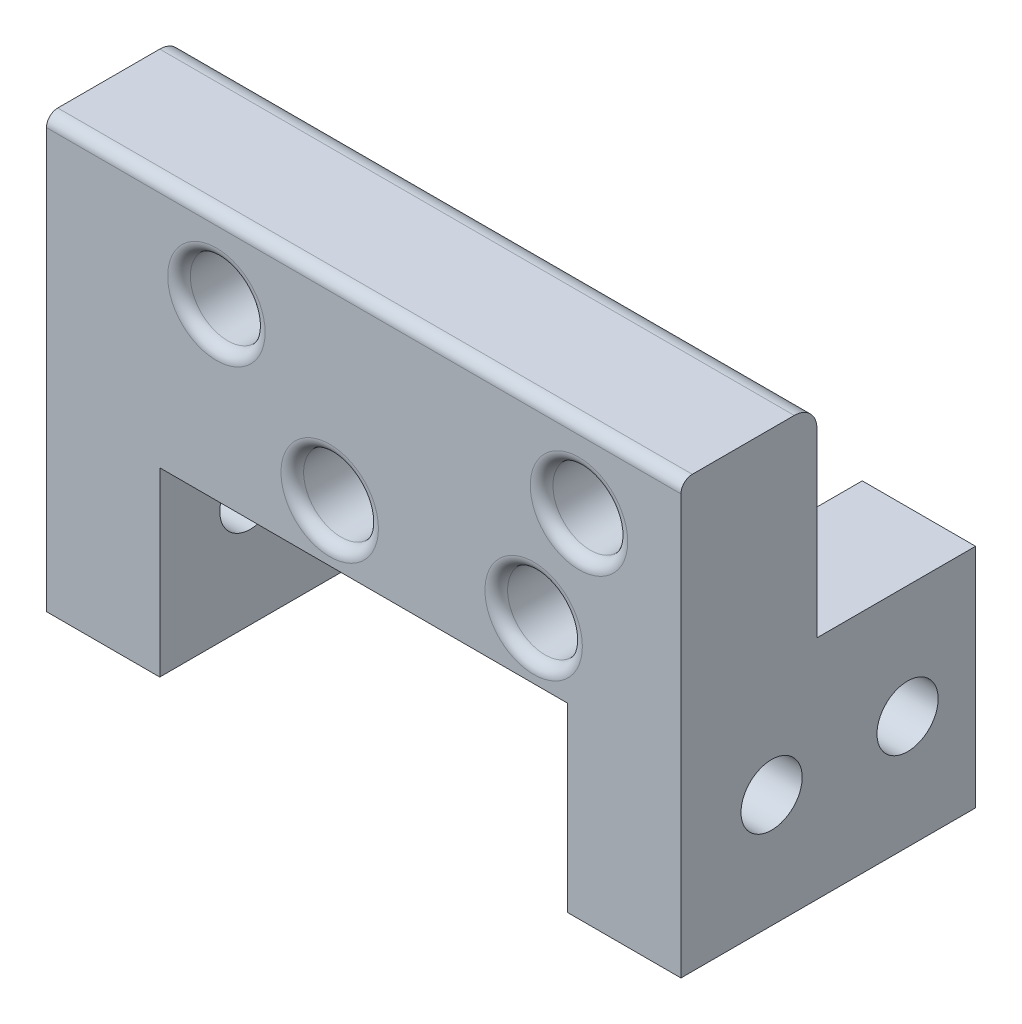
ISO-10303-21;
HEADER;
FILE_DESCRIPTION(('STEP AP214'),'2;1');
FILE_NAME('part.step','',(''),(''),'','','');
FILE_SCHEMA(('AUTOMOTIVE_DESIGN { 1 0 10303 214 1 1 1 1 }'));
ENDSEC;
DATA;
#1=APPLICATION_CONTEXT('core data for automotive mechanical design processes');
#2=APPLICATION_PROTOCOL_DEFINITION('international standard','automotive_design',2000,#1);
#3=PRODUCT_CONTEXT('',#1,'mechanical');
#4=PRODUCT('Part','Part','',(#3));
#5=PRODUCT_RELATED_PRODUCT_CATEGORY('part','',(#4));
#6=PRODUCT_DEFINITION_FORMATION('','',#4);
#7=PRODUCT_DEFINITION_CONTEXT('part definition',#1,'design');
#8=PRODUCT_DEFINITION('design','',#6,#7);
#9=PRODUCT_DEFINITION_SHAPE('','',#8);
#10=(LENGTH_UNIT() NAMED_UNIT(*) SI_UNIT(.MILLI.,.METRE.));
#11=(NAMED_UNIT(*) PLANE_ANGLE_UNIT() SI_UNIT($,.RADIAN.));
#12=(NAMED_UNIT(*) SI_UNIT($,.STERADIAN.) SOLID_ANGLE_UNIT());
#13=UNCERTAINTY_MEASURE_WITH_UNIT(LENGTH_MEASURE(1.E-05),#10,'distance_accuracy_value','');
#14=(GEOMETRIC_REPRESENTATION_CONTEXT(3) GLOBAL_UNCERTAINTY_ASSIGNED_CONTEXT((#13)) GLOBAL_UNIT_ASSIGNED_CONTEXT((#10,
#11,#12)) REPRESENTATION_CONTEXT('',''));
#15=CARTESIAN_POINT('',(0.,0.,0.));
#16=DIRECTION('',(0.,0.,1.));
#17=DIRECTION('',(1.,0.,0.));
#18=AXIS2_PLACEMENT_3D('',#15,#16,#17);
#19=CARTESIAN_POINT('',(-14.,11.,-6.));
#20=DIRECTION('',(1.,0.,0.));
#21=DIRECTION('',(0.,1.,0.));
#22=AXIS2_PLACEMENT_3D('',#19,#20,#21);
#23=PLANE('',#22);
#24=CARTESIAN_POINT('',(-14.,-3.,-10.));
#25=DIRECTION('',(-1.,0.,0.));
#26=DIRECTION('',(0.,1.,0.));
#27=AXIS2_PLACEMENT_3D('',#24,#25,#26);
#28=CIRCLE('',#27,1.35);
#29=CARTESIAN_POINT('',(-14.,-1.65,-10.));
#30=VERTEX_POINT('',#29);
#31=EDGE_CURVE('E362',#30,#30,#28,.T.);
#32=ORIENTED_EDGE('',*,*,#31,.F.);
#33=EDGE_LOOP('',(#32));
#34=FACE_BOUND('',#33,.T.);
#35=CARTESIAN_POINT('',(-14.,-3.,-4.));
#36=DIRECTION('',(-1.,0.,0.));
#37=DIRECTION('',(0.,1.,0.));
#38=AXIS2_PLACEMENT_3D('',#35,#36,#37);
#39=CIRCLE('',#38,1.35);
#40=CARTESIAN_POINT('',(-14.,-1.65,-4.));
#41=VERTEX_POINT('',#40);
#42=EDGE_CURVE('E359',#41,#41,#39,.T.);
#43=ORIENTED_EDGE('',*,*,#42,.F.);
#44=EDGE_LOOP('',(#43));
#45=FACE_BOUND('',#44,.T.);
#46=DIRECTION('',(0.,0.,1.));
#47=VECTOR('',#46,1.);
#48=CARTESIAN_POINT('',(-14.,11.,-6.));
#49=LINE('',#48,#47);
#50=CARTESIAN_POINT('',(-14.,11.,-5.));
#51=VERTEX_POINT('',#50);
#52=CARTESIAN_POINT('',(-14.,11.,-0.5));
#53=VERTEX_POINT('',#52);
#54=EDGE_CURVE('E431',#51,#53,#49,.T.);
#55=ORIENTED_EDGE('',*,*,#54,.F.);
#56=CARTESIAN_POINT('',(-14.,10.,-5.));
#57=DIRECTION('',(-1.,0.,0.));
#58=DIRECTION('',(0.,1.,0.));
#59=AXIS2_PLACEMENT_3D('',#56,#57,#58);
#60=CIRCLE('',#59,1.);
#61=CARTESIAN_POINT('',(-14.,10.,-6.));
#62=VERTEX_POINT('',#61);
#63=EDGE_CURVE('E178',#62,#51,#60,.F.);
#64=ORIENTED_EDGE('',*,*,#63,.F.);
#65=DIRECTION('',(0.,-1.,0.));
#66=VECTOR('',#65,1.);
#67=CARTESIAN_POINT('',(-14.,11.,-6.));
#68=LINE('',#67,#66);
#69=CARTESIAN_POINT('',(-14.,2.00000000000001,-6.));
#70=VERTEX_POINT('',#69);
#71=EDGE_CURVE('E422',#62,#70,#68,.T.);
#72=ORIENTED_EDGE('',*,*,#71,.T.);
#73=DIRECTION('',(0.,0.,1.));
#74=VECTOR('',#73,1.);
#75=CARTESIAN_POINT('',(-14.,2.00000000000001,0.));
#76=LINE('',#75,#74);
#77=CARTESIAN_POINT('',(-14.,2.00000000000001,-13.));
#78=VERTEX_POINT('',#77);
#79=EDGE_CURVE('E382',#78,#70,#76,.T.);
#80=ORIENTED_EDGE('',*,*,#79,.F.);
#81=DIRECTION('',(0.,1.,0.));
#82=VECTOR('',#81,1.);
#83=CARTESIAN_POINT('',(-14.,-8.,-13.));
#84=LINE('',#83,#82);
#85=CARTESIAN_POINT('',(-14.,-8.,-13.));
#86=VERTEX_POINT('',#85);
#87=EDGE_CURVE('E348',#86,#78,#84,.T.);
#88=ORIENTED_EDGE('',*,*,#87,.F.);
#89=DIRECTION('',(0.,0.,1.));
#90=VECTOR('',#89,1.);
#91=CARTESIAN_POINT('',(-14.,-8.,-6.));
#92=LINE('',#91,#90);
#93=CARTESIAN_POINT('',(-14.,-8.,0.));
#94=VERTEX_POINT('',#93);
#95=EDGE_CURVE('E173',#86,#94,#92,.T.);
#96=ORIENTED_EDGE('',*,*,#95,.T.);
#97=DIRECTION('',(0.,-1.,0.));
#98=VECTOR('',#97,1.);
#99=CARTESIAN_POINT('',(-14.,11.,0.));
#100=LINE('',#99,#98);
#101=CARTESIAN_POINT('',(-14.,10.5,0.));
#102=VERTEX_POINT('',#101);
#103=EDGE_CURVE('E335',#102,#94,#100,.T.);
#104=ORIENTED_EDGE('',*,*,#103,.F.);
#105=CARTESIAN_POINT('',(-14.,10.5,-0.5));
#106=DIRECTION('',(-1.,0.,0.));
#107=DIRECTION('',(0.,1.,0.));
#108=AXIS2_PLACEMENT_3D('',#105,#106,#107);
#109=CIRCLE('',#108,0.5);
#110=EDGE_CURVE('E191',#53,#102,#109,.F.);
#111=ORIENTED_EDGE('',*,*,#110,.F.);
#112=EDGE_LOOP('',(#55,#64,#72,#80,#88,#96,#104,#111));
#113=FACE_BOUND('',#112,.T.);
#114=ADVANCED_FACE('F37',(#34,#45,#113),#23,.F.);
#115=CARTESIAN_POINT('',(-14.,-8.,-6.));
#116=DIRECTION('',(0.,1.,0.));
#117=DIRECTION('',(0.,0.,-1.));
#118=AXIS2_PLACEMENT_3D('',#115,#116,#117);
#119=PLANE('',#118);
#120=DIRECTION('',(1.,0.,0.));
#121=VECTOR('',#120,1.);
#122=CARTESIAN_POINT('',(-14.,-8.,0.));
#123=LINE('',#122,#121);
#124=CARTESIAN_POINT('',(-9.,-8.,0.));
#125=VERTEX_POINT('',#124);
#126=EDGE_CURVE('E338',#94,#125,#123,.T.);
#127=ORIENTED_EDGE('',*,*,#126,.F.);
#128=ORIENTED_EDGE('',*,*,#95,.F.);
#129=DIRECTION('',(-1.,0.,0.));
#130=VECTOR('',#129,1.);
#131=CARTESIAN_POINT('',(7.40121946685673,-8.,-13.));
#132=LINE('',#131,#130);
#133=CARTESIAN_POINT('',(-9.,-8.,-13.));
#134=VERTEX_POINT('',#133);
#135=EDGE_CURVE('E385',#134,#86,#132,.T.);
#136=ORIENTED_EDGE('',*,*,#135,.F.);
#137=DIRECTION('',(0.,0.,1.));
#138=VECTOR('',#137,1.);
#139=CARTESIAN_POINT('',(-9.,-8.,-6.));
#140=LINE('',#139,#138);
#141=EDGE_CURVE('E350',#134,#125,#140,.T.);
#142=ORIENTED_EDGE('',*,*,#141,.T.);
#143=EDGE_LOOP('',(#127,#128,#136,#142));
#144=FACE_BOUND('',#143,.T.);
#145=ADVANCED_FACE('F267',(#144),#119,.F.);
#146=CARTESIAN_POINT('',(-9.,0.,-6.));
#147=DIRECTION('',(-1.,0.,0.));
#148=DIRECTION('',(0.,-1.,0.));
#149=AXIS2_PLACEMENT_3D('',#146,#147,#148);
#150=PLANE('',#149);
#151=CARTESIAN_POINT('',(-9.,-3.,-10.));
#152=DIRECTION('',(1.,0.,0.));
#153=DIRECTION('',(0.,-1.,0.));
#154=AXIS2_PLACEMENT_3D('',#151,#152,#153);
#155=CIRCLE('',#154,1.35);
#156=CARTESIAN_POINT('',(-9.,-4.35,-10.));
#157=VERTEX_POINT('',#156);
#158=EDGE_CURVE('E360',#157,#157,#155,.F.);
#159=ORIENTED_EDGE('',*,*,#158,.T.);
#160=EDGE_LOOP('',(#159));
#161=FACE_BOUND('',#160,.T.);
#162=CARTESIAN_POINT('',(-9.,-3.,-4.));
#163=DIRECTION('',(1.,0.,0.));
#164=DIRECTION('',(0.,-1.,0.));
#165=AXIS2_PLACEMENT_3D('',#162,#163,#164);
#166=CIRCLE('',#165,1.35);
#167=CARTESIAN_POINT('',(-9.,-4.35,-4.));
#168=VERTEX_POINT('',#167);
#169=EDGE_CURVE('E357',#168,#168,#166,.F.);
#170=ORIENTED_EDGE('',*,*,#169,.T.);
#171=EDGE_LOOP('',(#170));
#172=FACE_BOUND('',#171,.T.);
#173=DIRECTION('',(0.,1.,0.));
#174=VECTOR('',#173,1.);
#175=CARTESIAN_POINT('',(-9.,0.,0.));
#176=LINE('',#175,#174);
#177=CARTESIAN_POINT('',(-9.,0.,0.));
#178=VERTEX_POINT('',#177);
#179=EDGE_CURVE('E434',#125,#178,#176,.T.);
#180=ORIENTED_EDGE('',*,*,#179,.F.);
#181=ORIENTED_EDGE('',*,*,#141,.F.);
#182=DIRECTION('',(0.,-1.,0.));
#183=VECTOR('',#182,1.);
#184=CARTESIAN_POINT('',(-9.,-8.,-13.));
#185=LINE('',#184,#183);
#186=CARTESIAN_POINT('',(-9.00000000000001,2.00000000000001,-13.));
#187=VERTEX_POINT('',#186);
#188=EDGE_CURVE('E374',#187,#134,#185,.T.);
#189=ORIENTED_EDGE('',*,*,#188,.F.);
#190=DIRECTION('',(0.,0.,-1.));
#191=VECTOR('',#190,1.);
#192=CARTESIAN_POINT('',(-9.,2.00000000000001,0.));
#193=LINE('',#192,#191);
#194=CARTESIAN_POINT('',(-9.,2.00000000000001,-6.));
#195=VERTEX_POINT('',#194);
#196=EDGE_CURVE('E376',#195,#187,#193,.T.);
#197=ORIENTED_EDGE('',*,*,#196,.F.);
#198=DIRECTION('',(0.,-1.,0.));
#199=VECTOR('',#198,1.);
#200=CARTESIAN_POINT('',(-9.,0.,-6.));
#201=LINE('',#200,#199);
#202=CARTESIAN_POINT('',(-9.,0.,-6.));
#203=VERTEX_POINT('',#202);
#204=EDGE_CURVE('E380',#195,#203,#201,.T.);
#205=ORIENTED_EDGE('',*,*,#204,.T.);
#206=DIRECTION('',(0.,0.,1.));
#207=VECTOR('',#206,1.);
#208=CARTESIAN_POINT('',(-9.,0.,-6.));
#209=LINE('',#208,#207);
#210=EDGE_CURVE('E353',#203,#178,#209,.T.);
#211=ORIENTED_EDGE('',*,*,#210,.T.);
#212=EDGE_LOOP('',(#180,#181,#189,#197,#205,#211));
#213=FACE_BOUND('',#212,.T.);
#214=ADVANCED_FACE('F263',(#161,#172,#213),#150,.F.);
#215=CARTESIAN_POINT('',(-9.,0.,-6.));
#216=DIRECTION('',(0.,1.,0.));
#217=DIRECTION('',(0.,0.,-1.));
#218=AXIS2_PLACEMENT_3D('',#215,#216,#217);
#219=PLANE('',#218);
#220=DIRECTION('',(1.,0.,0.));
#221=VECTOR('',#220,1.);
#222=CARTESIAN_POINT('',(-9.,0.,0.));
#223=LINE('',#222,#221);
#224=CARTESIAN_POINT('',(9.,0.,0.));
#225=VERTEX_POINT('',#224);
#226=EDGE_CURVE('E436',#178,#225,#223,.T.);
#227=ORIENTED_EDGE('',*,*,#226,.F.);
#228=ORIENTED_EDGE('',*,*,#210,.F.);
#229=DIRECTION('',(1.,0.,0.));
#230=VECTOR('',#229,1.);
#231=CARTESIAN_POINT('',(-9.,0.,-6.));
#232=LINE('',#231,#230);
#233=CARTESIAN_POINT('',(9.,0.,-6.));
#234=VERTEX_POINT('',#233);
#235=EDGE_CURVE('E425',#203,#234,#232,.T.);
#236=ORIENTED_EDGE('',*,*,#235,.T.);
#237=DIRECTION('',(0.,0.,1.));
#238=VECTOR('',#237,1.);
#239=CARTESIAN_POINT('',(9.,0.,-6.));
#240=LINE('',#239,#238);
#241=EDGE_CURVE('E457',#234,#225,#240,.T.);
#242=ORIENTED_EDGE('',*,*,#241,.T.);
#243=EDGE_LOOP('',(#227,#228,#236,#242));
#244=FACE_BOUND('',#243,.T.);
#245=ADVANCED_FACE('F258',(#244),#219,.F.);
#246=CARTESIAN_POINT('',(9.,0.,-6.));
#247=DIRECTION('',(1.,0.,0.));
#248=DIRECTION('',(0.,1.,0.));
#249=AXIS2_PLACEMENT_3D('',#246,#247,#248);
#250=PLANE('',#249);
#251=CARTESIAN_POINT('',(9.,-3.,-10.));
#252=DIRECTION('',(-1.,0.,0.));
#253=DIRECTION('',(0.,1.,0.));
#254=AXIS2_PLACEMENT_3D('',#251,#252,#253);
#255=CIRCLE('',#254,1.35);
#256=CARTESIAN_POINT('',(9.,-1.65,-10.));
#257=VERTEX_POINT('',#256);
#258=EDGE_CURVE('E395',#257,#257,#255,.T.);
#259=ORIENTED_EDGE('',*,*,#258,.F.);
#260=EDGE_LOOP('',(#259));
#261=FACE_BOUND('',#260,.T.);
#262=CARTESIAN_POINT('',(9.,-3.,-4.));
#263=DIRECTION('',(-1.,0.,0.));
#264=DIRECTION('',(0.,1.,0.));
#265=AXIS2_PLACEMENT_3D('',#262,#263,#264);
#266=CIRCLE('',#265,1.35);
#267=CARTESIAN_POINT('',(9.,-1.65,-4.));
#268=VERTEX_POINT('',#267);
#269=EDGE_CURVE('E401',#268,#268,#266,.T.);
#270=ORIENTED_EDGE('',*,*,#269,.F.);
#271=EDGE_LOOP('',(#270));
#272=FACE_BOUND('',#271,.T.);
#273=DIRECTION('',(0.,1.,0.));
#274=VECTOR('',#273,1.);
#275=CARTESIAN_POINT('',(9.,0.,-10.));
#276=LINE('',#275,#274);
#277=CARTESIAN_POINT('',(9.,1.81261364575663,-10.));
#278=VERTEX_POINT('',#277);
#279=CARTESIAN_POINT('',(9.,2.,-10.));
#280=VERTEX_POINT('',#279);
#281=EDGE_CURVE('E164',#278,#280,#276,.T.);
#282=ORIENTED_EDGE('',*,*,#281,.T.);
#283=DIRECTION('',(0.,0.,1.));
#284=VECTOR('',#283,1.);
#285=CARTESIAN_POINT('',(9.,2.,-6.));
#286=LINE('',#285,#284);
#287=CARTESIAN_POINT('',(9.,2.,-13.));
#288=VERTEX_POINT('',#287);
#289=EDGE_CURVE('E172',#288,#280,#286,.T.);
#290=ORIENTED_EDGE('',*,*,#289,.F.);
#291=DIRECTION('',(0.,1.,0.));
#292=VECTOR('',#291,1.);
#293=CARTESIAN_POINT('',(9.,-8.,-13.));
#294=LINE('',#293,#292);
#295=CARTESIAN_POINT('',(9.,-8.,-13.));
#296=VERTEX_POINT('',#295);
#297=EDGE_CURVE('E405',#296,#288,#294,.T.);
#298=ORIENTED_EDGE('',*,*,#297,.F.);
#299=DIRECTION('',(0.,0.,1.));
#300=VECTOR('',#299,1.);
#301=CARTESIAN_POINT('',(9.,-8.,-6.));
#302=LINE('',#301,#300);
#303=CARTESIAN_POINT('',(9.,-8.,0.));
#304=VERTEX_POINT('',#303);
#305=EDGE_CURVE('E454',#296,#304,#302,.T.);
#306=ORIENTED_EDGE('',*,*,#305,.T.);
#307=DIRECTION('',(0.,-1.,0.));
#308=VECTOR('',#307,1.);
#309=CARTESIAN_POINT('',(9.,0.,0.));
#310=LINE('',#309,#308);
#311=EDGE_CURVE('E439',#225,#304,#310,.T.);
#312=ORIENTED_EDGE('',*,*,#311,.F.);
#313=ORIENTED_EDGE('',*,*,#241,.F.);
#314=DIRECTION('',(0.,-1.,0.));
#315=VECTOR('',#314,1.);
#316=CARTESIAN_POINT('',(9.,-8.,-6.));
#317=LINE('',#316,#315);
#318=CARTESIAN_POINT('',(9.,0.959707819925066,-6.));
#319=VERTEX_POINT('',#318);
#320=EDGE_CURVE('E408',#319,#234,#317,.T.);
#321=ORIENTED_EDGE('',*,*,#320,.F.);
#322=CARTESIAN_POINT('',(9.,1.81261364575663,-5.5));
#323=CARTESIAN_POINT('',(9.,1.8126591816624,-5.51348036406309));
#324=CARTESIAN_POINT('',(9.,1.81130665957017,-5.52689261792133));
#325=CARTESIAN_POINT('',(9.,1.80625261314981,-5.55306745263035));
#326=CARTESIAN_POINT('',(9.,1.80258681008768,-5.56583677956758));
#327=CARTESIAN_POINT('',(9.,1.79183074168382,-5.59465351094523));
#328=CARTESIAN_POINT('',(9.,1.78401590936935,-5.61042319384676));
#329=CARTESIAN_POINT('',(9.,1.76601559537922,-5.64063386133896));
#330=CARTESIAN_POINT('',(9.,1.75581372909091,-5.65506465366242));
#331=CARTESIAN_POINT('',(9.,1.72468823795662,-5.69410040084578));
#332=CARTESIAN_POINT('',(9.,1.70189896071376,-5.71719669653012));
#333=CARTESIAN_POINT('',(9.,1.65344147647108,-5.76007312108177));
#334=CARTESIAN_POINT('',(9.,1.62776633876312,-5.77984496920168));
#335=CARTESIAN_POINT('',(9.,1.5756366273866,-5.81589421914201));
#336=CARTESIAN_POINT('',(9.,1.5492580785837,-5.83228224283006));
#337=CARTESIAN_POINT('',(9.,1.49521869451491,-5.8628015008431));
#338=CARTESIAN_POINT('',(9.,1.46755683882538,-5.87693089811384));
#339=CARTESIAN_POINT('',(9.,1.38310764319855,-5.91606170271684));
#340=CARTESIAN_POINT('',(9.,1.32479127996297,-5.93784914937357));
#341=CARTESIAN_POINT('',(9.,1.2155015002966,-5.96944631062034));
#342=CARTESIAN_POINT('',(9.,1.16492695446033,-5.98064819464343));
#343=CARTESIAN_POINT('',(9.,1.08833626671418,-5.99210083911576));
#344=CARTESIAN_POINT('',(9.,1.06271158422747,-5.9950264183474));
#345=CARTESIAN_POINT('',(9.,1.01129892361405,-5.99897514512523));
#346=CARTESIAN_POINT('',(9.,0.98551084085954,-5.99999691629082));
#347=CARTESIAN_POINT('',(9.,0.959707819925065,-6.));
#348=B_SPLINE_CURVE_WITH_KNOTS('',3,(#322,#323,#324,#325,#326,#327,#328,#329,#330,#331,#332,
#333,#334,#335,#336,#337,#338,#339,#340,#341,#342,#343,#344,#345,#346,#347),.UNSPECIFIED.,.F.,
.F.,(4,2,2,2,2,2,2,2,2,2,2,2,4),(0.,0.0402642341494905,0.0799214396629735,0.132422385468716,
0.185294855487106,0.282096865354971,0.379136534202487,0.472167115303711,0.565272982020955,
0.751251693338968,0.906191009604644,0.983500044294667,1.06086494881308),.UNSPECIFIED.);
#349=CARTESIAN_POINT('',(9.,1.81261364575663,-5.5));
#350=VERTEX_POINT('',#349);
#351=EDGE_CURVE('E50',#350,#319,#348,.T.);
#352=ORIENTED_EDGE('',*,*,#351,.F.);
#353=DIRECTION('',(0.,0.,1.));
#354=VECTOR('',#353,1.);
#355=CARTESIAN_POINT('',(9.,1.81261364575663,-10.));
#356=LINE('',#355,#354);
#357=EDGE_CURVE('E367',#278,#350,#356,.T.);
#358=ORIENTED_EDGE('',*,*,#357,.F.);
#359=EDGE_LOOP('',(#282,#290,#298,#306,#312,#313,#321,#352,#358));
#360=FACE_BOUND('',#359,.T.);
#361=ADVANCED_FACE('F252',(#261,#272,#360),#250,.F.);
#362=CARTESIAN_POINT('',(14.,-8.,-6.));
#363=DIRECTION('',(0.,1.,0.));
#364=DIRECTION('',(0.,0.,-1.));
#365=AXIS2_PLACEMENT_3D('',#362,#363,#364);
#366=PLANE('',#365);
#367=DIRECTION('',(1.,0.,0.));
#368=VECTOR('',#367,1.);
#369=CARTESIAN_POINT('',(14.,-8.,0.));
#370=LINE('',#369,#368);
#371=CARTESIAN_POINT('',(14.,-8.,0.));
#372=VERTEX_POINT('',#371);
#373=EDGE_CURVE('E442',#304,#372,#370,.T.);
#374=ORIENTED_EDGE('',*,*,#373,.F.);
#375=ORIENTED_EDGE('',*,*,#305,.F.);
#376=DIRECTION('',(1.,0.,0.));
#377=VECTOR('',#376,1.);
#378=CARTESIAN_POINT('',(-3.2065556157337,-8.,-13.));
#379=LINE('',#378,#377);
#380=CARTESIAN_POINT('',(14.,-8.,-13.));
#381=VERTEX_POINT('',#380);
#382=EDGE_CURVE('E409',#296,#381,#379,.T.);
#383=ORIENTED_EDGE('',*,*,#382,.T.);
#384=DIRECTION('',(0.,0.,1.));
#385=VECTOR('',#384,1.);
#386=CARTESIAN_POINT('',(14.,-8.,-6.));
#387=LINE('',#386,#385);
#388=EDGE_CURVE('E451',#381,#372,#387,.T.);
#389=ORIENTED_EDGE('',*,*,#388,.T.);
#390=EDGE_LOOP('',(#374,#375,#383,#389));
#391=FACE_BOUND('',#390,.T.);
#392=ADVANCED_FACE('F257',(#391),#366,.F.);
#393=CARTESIAN_POINT('',(14.,11.,-6.));
#394=DIRECTION('',(-1.,0.,0.));
#395=DIRECTION('',(0.,-1.,0.));
#396=AXIS2_PLACEMENT_3D('',#393,#394,#395);
#397=PLANE('',#396);
#398=CARTESIAN_POINT('',(14.,-3.,-10.));
#399=DIRECTION('',(-1.,0.,0.));
#400=DIRECTION('',(0.,1.,0.));
#401=AXIS2_PLACEMENT_3D('',#398,#399,#400);
#402=CIRCLE('',#401,1.35);
#403=CARTESIAN_POINT('',(14.,-1.65,-10.));
#404=VERTEX_POINT('',#403);
#405=EDGE_CURVE('E392',#404,#404,#402,.T.);
#406=ORIENTED_EDGE('',*,*,#405,.T.);
#407=EDGE_LOOP('',(#406));
#408=FACE_BOUND('',#407,.T.);
#409=CARTESIAN_POINT('',(14.,-3.,-4.));
#410=DIRECTION('',(-1.,0.,0.));
#411=DIRECTION('',(0.,1.,0.));
#412=AXIS2_PLACEMENT_3D('',#409,#410,#411);
#413=CIRCLE('',#412,1.35);
#414=CARTESIAN_POINT('',(14.,-1.65,-4.));
#415=VERTEX_POINT('',#414);
#416=EDGE_CURVE('E398',#415,#415,#413,.T.);
#417=ORIENTED_EDGE('',*,*,#416,.T.);
#418=EDGE_LOOP('',(#417));
#419=FACE_BOUND('',#418,.T.);
#420=DIRECTION('',(0.,1.,0.));
#421=VECTOR('',#420,1.);
#422=CARTESIAN_POINT('',(14.,11.,0.));
#423=LINE('',#422,#421);
#424=CARTESIAN_POINT('',(14.,10.5,0.));
#425=VERTEX_POINT('',#424);
#426=EDGE_CURVE('E426',#372,#425,#423,.T.);
#427=ORIENTED_EDGE('',*,*,#426,.F.);
#428=ORIENTED_EDGE('',*,*,#388,.F.);
#429=DIRECTION('',(0.,-1.,0.));
#430=VECTOR('',#429,1.);
#431=CARTESIAN_POINT('',(14.,-8.,-13.));
#432=LINE('',#431,#430);
#433=CARTESIAN_POINT('',(14.,2.,-13.));
#434=VERTEX_POINT('',#433);
#435=EDGE_CURVE('E413',#434,#381,#432,.T.);
#436=ORIENTED_EDGE('',*,*,#435,.F.);
#437=DIRECTION('',(0.,0.,-1.));
#438=VECTOR('',#437,1.);
#439=CARTESIAN_POINT('',(14.,2.,-6.));
#440=LINE('',#439,#438);
#441=CARTESIAN_POINT('',(14.,2.,-6.));
#442=VERTEX_POINT('',#441);
#443=EDGE_CURVE('E404',#442,#434,#440,.T.);
#444=ORIENTED_EDGE('',*,*,#443,.F.);
#445=DIRECTION('',(0.,1.,0.));
#446=VECTOR('',#445,1.);
#447=CARTESIAN_POINT('',(14.,11.,-6.));
#448=LINE('',#447,#446);
#449=CARTESIAN_POINT('',(14.,10.,-6.));
#450=VERTEX_POINT('',#449);
#451=EDGE_CURVE('E429',#442,#450,#448,.T.);
#452=ORIENTED_EDGE('',*,*,#451,.T.);
#453=CARTESIAN_POINT('',(14.,10.,-5.));
#454=DIRECTION('',(1.,0.,0.));
#455=DIRECTION('',(0.,-1.,0.));
#456=AXIS2_PLACEMENT_3D('',#453,#454,#455);
#457=CIRCLE('',#456,1.);
#458=CARTESIAN_POINT('',(14.,11.,-5.));
#459=VERTEX_POINT('',#458);
#460=EDGE_CURVE('E186',#459,#450,#457,.F.);
#461=ORIENTED_EDGE('',*,*,#460,.F.);
#462=DIRECTION('',(0.,0.,1.));
#463=VECTOR('',#462,1.);
#464=CARTESIAN_POINT('',(14.,11.,-6.));
#465=LINE('',#464,#463);
#466=CARTESIAN_POINT('',(14.,11.,-0.5));
#467=VERTEX_POINT('',#466);
#468=EDGE_CURVE('E448',#459,#467,#465,.T.);
#469=ORIENTED_EDGE('',*,*,#468,.T.);
#470=CARTESIAN_POINT('',(14.,10.5,-0.5));
#471=DIRECTION('',(1.,0.,0.));
#472=DIRECTION('',(0.,-1.,0.));
#473=AXIS2_PLACEMENT_3D('',#470,#471,#472);
#474=CIRCLE('',#473,0.5);
#475=EDGE_CURVE('E208',#425,#467,#474,.F.);
#476=ORIENTED_EDGE('',*,*,#475,.F.);
#477=EDGE_LOOP('',(#427,#428,#436,#444,#452,#461,#469,#476));
#478=FACE_BOUND('',#477,.T.);
#479=ADVANCED_FACE('F475',(#408,#419,#478),#397,.F.);
#480=CARTESIAN_POINT('',(14.,11.,-6.));
#481=DIRECTION('',(0.,-1.,0.));
#482=DIRECTION('',(1.,0.,0.));
#483=AXIS2_PLACEMENT_3D('',#480,#481,#482);
#484=PLANE('',#483);
#485=ORIENTED_EDGE('',*,*,#468,.F.);
#486=DIRECTION('',(-1.,0.,0.));
#487=VECTOR('',#486,1.);
#488=CARTESIAN_POINT('',(14.,11.,-5.));
#489=LINE('',#488,#487);
#490=EDGE_CURVE('E184',#51,#459,#489,.F.);
#491=ORIENTED_EDGE('',*,*,#490,.F.);
#492=ORIENTED_EDGE('',*,*,#54,.T.);
#493=DIRECTION('',(-1.,0.,0.));
#494=VECTOR('',#493,1.);
#495=CARTESIAN_POINT('',(14.,11.,-0.5));
#496=LINE('',#495,#494);
#497=EDGE_CURVE('E189',#467,#53,#496,.T.);
#498=ORIENTED_EDGE('',*,*,#497,.F.);
#499=EDGE_LOOP('',(#485,#491,#492,#498));
#500=FACE_BOUND('',#499,.T.);
#501=ADVANCED_FACE('F481',(#500),#484,.F.);
#502=CARTESIAN_POINT('',(0.,0.,-6.));
#503=DIRECTION('',(0.,0.,-1.));
#504=DIRECTION('',(1.,0.,0.));
#505=AXIS2_PLACEMENT_3D('',#502,#503,#504);
#506=PLANE('',#505);
#507=CARTESIAN_POINT('',(9.5,7.5,-6.));
#508=DIRECTION('',(0.,0.,1.));
#509=DIRECTION('',(1.,0.,0.));
#510=AXIS2_PLACEMENT_3D('',#507,#508,#509);
#511=CIRCLE('',#510,2.15);
#512=CARTESIAN_POINT('',(11.65,7.5,-6.));
#513=VERTEX_POINT('',#512);
#514=EDGE_CURVE('E226',#513,#513,#511,.F.);
#515=ORIENTED_EDGE('',*,*,#514,.F.);
#516=EDGE_LOOP('',(#515));
#517=FACE_BOUND('',#516,.T.);
#518=CARTESIAN_POINT('',(-6.49999999999999,7.5,-6.));
#519=DIRECTION('',(0.,0.,1.));
#520=DIRECTION('',(1.,0.,0.));
#521=AXIS2_PLACEMENT_3D('',#518,#519,#520);
#522=CIRCLE('',#521,2.15);
#523=CARTESIAN_POINT('',(-4.34999999999999,7.5,-6.));
#524=VERTEX_POINT('',#523);
#525=EDGE_CURVE('E223',#524,#524,#522,.F.);
#526=ORIENTED_EDGE('',*,*,#525,.F.);
#527=EDGE_LOOP('',(#526));
#528=FACE_BOUND('',#527,.T.);
#529=CARTESIAN_POINT('',(-1.5,2.5,-6.));
#530=DIRECTION('',(0.,0.,1.));
#531=DIRECTION('',(1.,0.,0.));
#532=AXIS2_PLACEMENT_3D('',#529,#530,#531);
#533=CIRCLE('',#532,2.15);
#534=CARTESIAN_POINT('',(0.650000000000005,2.5,-6.));
#535=VERTEX_POINT('',#534);
#536=EDGE_CURVE('E220',#535,#535,#533,.F.);
#537=ORIENTED_EDGE('',*,*,#536,.F.);
#538=EDGE_LOOP('',(#537));
#539=FACE_BOUND('',#538,.T.);
#540=ORIENTED_EDGE('',*,*,#320,.T.);
#541=ORIENTED_EDGE('',*,*,#235,.F.);
#542=ORIENTED_EDGE('',*,*,#204,.F.);
#543=DIRECTION('',(-1.,0.,0.));
#544=VECTOR('',#543,1.);
#545=CARTESIAN_POINT('',(0.,2.00000000000001,-6.));
#546=LINE('',#545,#544);
#547=EDGE_CURVE('E390',#195,#70,#546,.T.);
#548=ORIENTED_EDGE('',*,*,#547,.T.);
#549=ORIENTED_EDGE('',*,*,#71,.F.);
#550=DIRECTION('',(-1.,0.,0.));
#551=VECTOR('',#550,1.);
#552=CARTESIAN_POINT('',(-14.,10.,-6.));
#553=LINE('',#552,#551);
#554=EDGE_CURVE('E176',#450,#62,#553,.T.);
#555=ORIENTED_EDGE('',*,*,#554,.F.);
#556=ORIENTED_EDGE('',*,*,#451,.F.);
#557=DIRECTION('',(1.,0.,0.));
#558=VECTOR('',#557,1.);
#559=CARTESIAN_POINT('',(-3.2065556157337,2.,-6.));
#560=LINE('',#559,#558);
#561=CARTESIAN_POINT('',(9.59105236663265,2.,-6.));
#562=VERTEX_POINT('',#561);
#563=EDGE_CURVE('E415',#562,#442,#560,.T.);
#564=ORIENTED_EDGE('',*,*,#563,.F.);
#565=CARTESIAN_POINT('',(7.5,2.5,-6.));
#566=DIRECTION('',(0.,0.,1.));
#567=DIRECTION('',(1.,0.,0.));
#568=AXIS2_PLACEMENT_3D('',#565,#566,#567);
#569=CIRCLE('',#568,2.15);
#570=EDGE_CURVE('E217',#319,#562,#569,.F.);
#571=ORIENTED_EDGE('',*,*,#570,.F.);
#572=EDGE_LOOP('',(#540,#541,#542,#548,#549,#555,#556,#564,#571));
#573=FACE_BOUND('',#572,.T.);
#574=ADVANCED_FACE('F325',(#517,#528,#539,#573),#506,.T.);
#575=CARTESIAN_POINT('',(0.,0.,0.));
#576=DIRECTION('',(0.,0.,-1.));
#577=DIRECTION('',(1.,0.,0.));
#578=AXIS2_PLACEMENT_3D('',#575,#576,#577);
#579=PLANE('',#578);
#580=CARTESIAN_POINT('',(-6.49999999999999,7.5,0.));
#581=DIRECTION('',(0.,0.,1.));
#582=DIRECTION('',(1.,0.,0.));
#583=AXIS2_PLACEMENT_3D('',#580,#581,#582);
#584=CIRCLE('',#583,2.15);
#585=CARTESIAN_POINT('',(-4.34999999999999,7.5,0.));
#586=VERTEX_POINT('',#585);
#587=EDGE_CURVE('E203',#586,#586,#584,.T.);
#588=ORIENTED_EDGE('',*,*,#587,.F.);
#589=EDGE_LOOP('',(#588));
#590=FACE_BOUND('',#589,.T.);
#591=CARTESIAN_POINT('',(-1.5,2.5,0.));
#592=DIRECTION('',(0.,0.,1.));
#593=DIRECTION('',(1.,0.,0.));
#594=AXIS2_PLACEMENT_3D('',#591,#592,#593);
#595=CIRCLE('',#594,2.15);
#596=CARTESIAN_POINT('',(0.650000000000005,2.5,0.));
#597=VERTEX_POINT('',#596);
#598=EDGE_CURVE('E200',#597,#597,#595,.T.);
#599=ORIENTED_EDGE('',*,*,#598,.F.);
#600=EDGE_LOOP('',(#599));
#601=FACE_BOUND('',#600,.T.);
#602=CARTESIAN_POINT('',(7.5,2.5,0.));
#603=DIRECTION('',(0.,0.,1.));
#604=DIRECTION('',(1.,0.,0.));
#605=AXIS2_PLACEMENT_3D('',#602,#603,#604);
#606=CIRCLE('',#605,2.15);
#607=CARTESIAN_POINT('',(9.65,2.5,0.));
#608=VERTEX_POINT('',#607);
#609=EDGE_CURVE('E197',#608,#608,#606,.T.);
#610=ORIENTED_EDGE('',*,*,#609,.F.);
#611=EDGE_LOOP('',(#610));
#612=FACE_BOUND('',#611,.T.);
#613=CARTESIAN_POINT('',(9.5,7.5,0.));
#614=DIRECTION('',(0.,0.,1.));
#615=DIRECTION('',(1.,0.,0.));
#616=AXIS2_PLACEMENT_3D('',#613,#614,#615);
#617=CIRCLE('',#616,2.15);
#618=CARTESIAN_POINT('',(11.65,7.5,0.));
#619=VERTEX_POINT('',#618);
#620=EDGE_CURVE('E194',#619,#619,#617,.T.);
#621=ORIENTED_EDGE('',*,*,#620,.F.);
#622=EDGE_LOOP('',(#621));
#623=FACE_BOUND('',#622,.T.);
#624=ORIENTED_EDGE('',*,*,#103,.T.);
#625=ORIENTED_EDGE('',*,*,#126,.T.);
#626=ORIENTED_EDGE('',*,*,#179,.T.);
#627=ORIENTED_EDGE('',*,*,#226,.T.);
#628=ORIENTED_EDGE('',*,*,#311,.T.);
#629=ORIENTED_EDGE('',*,*,#373,.T.);
#630=ORIENTED_EDGE('',*,*,#426,.T.);
#631=DIRECTION('',(-1.,0.,0.));
#632=VECTOR('',#631,1.);
#633=CARTESIAN_POINT('',(0.,10.5,0.));
#634=LINE('',#633,#632);
#635=EDGE_CURVE('E206',#102,#425,#634,.F.);
#636=ORIENTED_EDGE('',*,*,#635,.F.);
#637=EDGE_LOOP('',(#624,#625,#626,#627,#628,#629,#630,#636));
#638=FACE_BOUND('',#637,.T.);
#639=ADVANCED_FACE('F321',(#590,#601,#612,#623,#638),#579,.F.);
#640=CARTESIAN_POINT('',(-3.2065556157337,-8.,-13.));
#641=DIRECTION('',(0.,0.,-1.));
#642=DIRECTION('',(1.,0.,0.));
#643=AXIS2_PLACEMENT_3D('',#640,#641,#642);
#644=PLANE('',#643);
#645=ORIENTED_EDGE('',*,*,#297,.T.);
#646=DIRECTION('',(1.,0.,0.));
#647=VECTOR('',#646,1.);
#648=CARTESIAN_POINT('',(-3.2065556157337,2.,-13.));
#649=LINE('',#648,#647);
#650=EDGE_CURVE('E418',#288,#434,#649,.T.);
#651=ORIENTED_EDGE('',*,*,#650,.T.);
#652=ORIENTED_EDGE('',*,*,#435,.T.);
#653=ORIENTED_EDGE('',*,*,#382,.F.);
#654=EDGE_LOOP('',(#645,#651,#652,#653));
#655=FACE_BOUND('',#654,.T.);
#656=ADVANCED_FACE('F324',(#655),#644,.T.);
#657=CARTESIAN_POINT('',(-3.2065556157337,2.,-6.));
#658=DIRECTION('',(0.,1.,0.));
#659=DIRECTION('',(-1.,0.,0.));
#660=AXIS2_PLACEMENT_3D('',#657,#658,#659);
#661=PLANE('',#660);
#662=DIRECTION('',(0.,0.,1.));
#663=VECTOR('',#662,1.);
#664=CARTESIAN_POINT('',(9.07241851935164,2.,-10.));
#665=LINE('',#664,#663);
#666=CARTESIAN_POINT('',(9.07241851935164,2.,-10.));
#667=VERTEX_POINT('',#666);
#668=CARTESIAN_POINT('',(9.07241851935164,2.,-5.5));
#669=VERTEX_POINT('',#668);
#670=EDGE_CURVE('E170',#667,#669,#665,.T.);
#671=ORIENTED_EDGE('',*,*,#670,.T.);
#672=CARTESIAN_POINT('',(9.59105236663265,2.,-6.));
#673=CARTESIAN_POINT('',(9.5612229719822,2.,-6.00002039557674));
#674=CARTESIAN_POINT('',(9.53140258352422,2.,-5.99747614543979));
#675=CARTESIAN_POINT('',(9.47261342010745,2.,-5.98744600327521));
#676=CARTESIAN_POINT('',(9.44364437337846,2.,-5.97996170653595));
#677=CARTESIAN_POINT('',(9.38735928787601,2.,-5.96023472709992));
#678=CARTESIAN_POINT('',(9.36004395261629,2.,-5.947990035472));
#679=CARTESIAN_POINT('',(9.30787444935242,2.,-5.9190677371537));
#680=CARTESIAN_POINT('',(9.28301977864075,2.,-5.90239103848677));
#681=CARTESIAN_POINT('',(9.23666572729724,2.,-5.86513902353725));
#682=CARTESIAN_POINT('',(9.21514729104684,2.,-5.84458745634605));
#683=CARTESIAN_POINT('',(9.17599675237474,2.,-5.80005265261453));
#684=CARTESIAN_POINT('',(9.15836495178443,2.,-5.77606914979261));
#685=CARTESIAN_POINT('',(9.1281241046842,2.,-5.72615122478059));
#686=CARTESIAN_POINT('',(9.11537446974959,2.,-5.7003019363742));
#687=CARTESIAN_POINT('',(9.09463224618295,2.,-5.64677532439796));
#688=CARTESIAN_POINT('',(9.08663357321355,2.,-5.61910038956305));
#689=CARTESIAN_POINT('',(9.07826204399019,2.,-5.57597235152276));
#690=CARTESIAN_POINT('',(9.07607230771745,2.,-5.56085137904041));
#691=CARTESIAN_POINT('',(9.07315103260698,2.,-5.53048964728084));
#692=CARTESIAN_POINT('',(9.07241755448766,2.,-5.51524907448106));
#693=CARTESIAN_POINT('',(9.07241851935163,2.,-5.5));
#694=B_SPLINE_CURVE_WITH_KNOTS('',3,(#672,#673,#674,#675,#676,#677,#678,#679,#680,#681,#682,
#683,#684,#685,#686,#687,#688,#689,#690,#691,#692,#693),.UNSPECIFIED.,.F.,.F.,(4,2,2,2,2,2,2,2,
2,2,4),(0.,0.0893677318764235,0.178706618357038,0.26808324767979,0.357441579740413,
0.446269060298131,0.535103436661614,0.621142553898406,0.707071245904614,0.752845228531472,
0.798558213496678),.UNSPECIFIED.);
#695=EDGE_CURVE('E11',#562,#669,#694,.T.);
#696=ORIENTED_EDGE('',*,*,#695,.F.);
#697=ORIENTED_EDGE('',*,*,#563,.T.);
#698=ORIENTED_EDGE('',*,*,#443,.T.);
#699=ORIENTED_EDGE('',*,*,#650,.F.);
#700=ORIENTED_EDGE('',*,*,#289,.T.);
#701=DIRECTION('',(-1.,0.,0.));
#702=VECTOR('',#701,1.);
#703=CARTESIAN_POINT('',(-3.2065556157337,2.,-10.));
#704=LINE('',#703,#702);
#705=EDGE_CURVE('E161',#667,#280,#704,.T.);
#706=ORIENTED_EDGE('',*,*,#705,.F.);
#707=EDGE_LOOP('',(#671,#696,#697,#698,#699,#700,#706));
#708=FACE_BOUND('',#707,.T.);
#709=ADVANCED_FACE('F169',(#708),#661,.T.);
#710=CARTESIAN_POINT('',(4.,-3.,-4.));
#711=DIRECTION('',(1.,0.,0.));
#712=DIRECTION('',(0.,1.,0.));
#713=AXIS2_PLACEMENT_3D('',#710,#711,#712);
#714=CYLINDRICAL_SURFACE('',#713,1.35);
#715=ORIENTED_EDGE('',*,*,#416,.F.);
#716=EDGE_LOOP('',(#715));
#717=FACE_BOUND('',#716,.T.);
#718=ORIENTED_EDGE('',*,*,#269,.T.);
#719=EDGE_LOOP('',(#718));
#720=FACE_BOUND('',#719,.T.);
#721=ADVANCED_FACE('F505',(#717,#720),#714,.F.);
#722=CARTESIAN_POINT('',(4.,-3.,-10.));
#723=DIRECTION('',(1.,0.,0.));
#724=DIRECTION('',(0.,1.,0.));
#725=AXIS2_PLACEMENT_3D('',#722,#723,#724);
#726=CYLINDRICAL_SURFACE('',#725,1.35);
#727=ORIENTED_EDGE('',*,*,#405,.F.);
#728=EDGE_LOOP('',(#727));
#729=FACE_BOUND('',#728,.T.);
#730=ORIENTED_EDGE('',*,*,#258,.T.);
#731=EDGE_LOOP('',(#730));
#732=FACE_BOUND('',#731,.T.);
#733=ADVANCED_FACE('F500',(#729,#732),#726,.F.);
#734=CARTESIAN_POINT('',(7.40121946685673,2.00000000000001,0.));
#735=DIRECTION('',(0.,1.,0.));
#736=DIRECTION('',(-1.,0.,0.));
#737=AXIS2_PLACEMENT_3D('',#734,#735,#736);
#738=PLANE('',#737);
#739=ORIENTED_EDGE('',*,*,#196,.T.);
#740=DIRECTION('',(-1.,0.,0.));
#741=VECTOR('',#740,1.);
#742=CARTESIAN_POINT('',(7.40121946685673,2.00000000000001,-13.));
#743=LINE('',#742,#741);
#744=EDGE_CURVE('E377',#187,#78,#743,.T.);
#745=ORIENTED_EDGE('',*,*,#744,.T.);
#746=ORIENTED_EDGE('',*,*,#79,.T.);
#747=ORIENTED_EDGE('',*,*,#547,.F.);
#748=EDGE_LOOP('',(#739,#745,#746,#747));
#749=FACE_BOUND('',#748,.T.);
#750=ADVANCED_FACE('F486',(#749),#738,.T.);
#751=CARTESIAN_POINT('',(7.40121946685673,-8.,-13.));
#752=DIRECTION('',(0.,0.,-1.));
#753=DIRECTION('',(1.,0.,0.));
#754=AXIS2_PLACEMENT_3D('',#751,#752,#753);
#755=PLANE('',#754);
#756=ORIENTED_EDGE('',*,*,#188,.T.);
#757=ORIENTED_EDGE('',*,*,#135,.T.);
#758=ORIENTED_EDGE('',*,*,#87,.T.);
#759=ORIENTED_EDGE('',*,*,#744,.F.);
#760=EDGE_LOOP('',(#756,#757,#758,#759));
#761=FACE_BOUND('',#760,.T.);
#762=ADVANCED_FACE('F489',(#761),#755,.T.);
#763=CARTESIAN_POINT('',(-4.,-3.,-4.));
#764=DIRECTION('',(-1.,0.,0.));
#765=DIRECTION('',(0.,-1.,0.));
#766=AXIS2_PLACEMENT_3D('',#763,#764,#765);
#767=CYLINDRICAL_SURFACE('',#766,1.35);
#768=ORIENTED_EDGE('',*,*,#42,.T.);
#769=EDGE_LOOP('',(#768));
#770=FACE_BOUND('',#769,.T.);
#771=ORIENTED_EDGE('',*,*,#169,.F.);
#772=EDGE_LOOP('',(#771));
#773=FACE_BOUND('',#772,.T.);
#774=ADVANCED_FACE('F491',(#770,#773),#767,.F.);
#775=CARTESIAN_POINT('',(-4.,-3.,-10.));
#776=DIRECTION('',(-1.,0.,0.));
#777=DIRECTION('',(0.,-1.,0.));
#778=AXIS2_PLACEMENT_3D('',#775,#776,#777);
#779=CYLINDRICAL_SURFACE('',#778,1.35);
#780=ORIENTED_EDGE('',*,*,#31,.T.);
#781=EDGE_LOOP('',(#780));
#782=FACE_BOUND('',#781,.T.);
#783=ORIENTED_EDGE('',*,*,#158,.F.);
#784=EDGE_LOOP('',(#783));
#785=FACE_BOUND('',#784,.T.);
#786=ADVANCED_FACE('F497',(#782,#785),#779,.F.);
#787=CARTESIAN_POINT('',(9.5,7.5,-10.));
#788=DIRECTION('',(0.,0.,1.));
#789=DIRECTION('',(-1.,0.,0.));
#790=AXIS2_PLACEMENT_3D('',#787,#788,#789);
#791=CYLINDRICAL_SURFACE('',#790,1.65);
#792=CARTESIAN_POINT('',(9.5,7.5,-5.5));
#793=DIRECTION('',(0.,0.,1.));
#794=DIRECTION('',(1.,0.,0.));
#795=AXIS2_PLACEMENT_3D('',#792,#793,#794);
#796=CIRCLE('',#795,1.65);
#797=CARTESIAN_POINT('',(11.15,7.5,-5.5));
#798=VERTEX_POINT('',#797);
#799=EDGE_CURVE('E214',#798,#798,#796,.T.);
#800=ORIENTED_EDGE('',*,*,#799,.F.);
#801=EDGE_LOOP('',(#800));
#802=FACE_BOUND('',#801,.T.);
#803=CARTESIAN_POINT('',(9.5,7.5,-0.5));
#804=DIRECTION('',(0.,0.,1.));
#805=DIRECTION('',(1.,0.,0.));
#806=AXIS2_PLACEMENT_3D('',#803,#804,#805);
#807=CIRCLE('',#806,1.65);
#808=CARTESIAN_POINT('',(11.15,7.5,-0.5));
#809=VERTEX_POINT('',#808);
#810=EDGE_CURVE('E211',#809,#809,#807,.F.);
#811=ORIENTED_EDGE('',*,*,#810,.F.);
#812=EDGE_LOOP('',(#811));
#813=FACE_BOUND('',#812,.T.);
#814=ADVANCED_FACE('F645',(#802,#813),#791,.F.);
#815=CARTESIAN_POINT('',(7.5,2.5,-10.));
#816=DIRECTION('',(0.,0.,1.));
#817=DIRECTION('',(-1.,0.,0.));
#818=AXIS2_PLACEMENT_3D('',#815,#816,#817);
#819=CYLINDRICAL_SURFACE('',#818,1.65);
#820=CARTESIAN_POINT('',(7.5,2.5,-0.5));
#821=DIRECTION('',(0.,0.,1.));
#822=DIRECTION('',(1.,0.,0.));
#823=AXIS2_PLACEMENT_3D('',#820,#821,#822);
#824=CIRCLE('',#823,1.65);
#825=CARTESIAN_POINT('',(9.15,2.5,-0.5));
#826=VERTEX_POINT('',#825);
#827=EDGE_CURVE('E241',#826,#826,#824,.F.);
#828=ORIENTED_EDGE('',*,*,#827,.F.);
#829=EDGE_LOOP('',(#828));
#830=FACE_BOUND('',#829,.T.);
#831=CARTESIAN_POINT('',(7.5,2.5,-5.5));
#832=DIRECTION('',(0.,0.,1.));
#833=DIRECTION('',(1.,0.,0.));
#834=AXIS2_PLACEMENT_3D('',#831,#832,#833);
#835=CIRCLE('',#834,1.65);
#836=EDGE_CURVE('E56',#669,#350,#835,.T.);
#837=ORIENTED_EDGE('',*,*,#836,.F.);
#838=ORIENTED_EDGE('',*,*,#670,.F.);
#839=CARTESIAN_POINT('',(7.5,2.5,-10.));
#840=DIRECTION('',(0.,0.,-1.));
#841=DIRECTION('',(-1.,0.,0.));
#842=AXIS2_PLACEMENT_3D('',#839,#840,#841);
#843=CIRCLE('',#842,1.65);
#844=EDGE_CURVE('E158',#667,#278,#843,.T.);
#845=ORIENTED_EDGE('',*,*,#844,.T.);
#846=ORIENTED_EDGE('',*,*,#357,.T.);
#847=EDGE_LOOP('',(#837,#838,#845,#846));
#848=FACE_BOUND('',#847,.T.);
#849=ADVANCED_FACE('F175',(#830,#848),#819,.F.);
#850=CARTESIAN_POINT('',(7.5,2.5,-10.));
#851=DIRECTION('',(0.,0.,1.));
#852=DIRECTION('',(-1.,0.,0.));
#853=AXIS2_PLACEMENT_3D('',#850,#851,#852);
#854=PLANE('',#853);
#855=ORIENTED_EDGE('',*,*,#281,.F.);
#856=ORIENTED_EDGE('',*,*,#844,.F.);
#857=ORIENTED_EDGE('',*,*,#705,.T.);
#858=EDGE_LOOP('',(#855,#856,#857));
#859=FACE_BOUND('',#858,.T.);
#860=ADVANCED_FACE('F160',(#859),#854,.T.);
#861=CARTESIAN_POINT('',(-6.49999999999999,7.5,-10.));
#862=DIRECTION('',(0.,0.,1.));
#863=DIRECTION('',(-1.,0.,0.));
#864=AXIS2_PLACEMENT_3D('',#861,#862,#863);
#865=CYLINDRICAL_SURFACE('',#864,1.65);
#866=CARTESIAN_POINT('',(-6.49999999999999,7.5,-5.5));
#867=DIRECTION('',(0.,0.,1.));
#868=DIRECTION('',(1.,0.,0.));
#869=AXIS2_PLACEMENT_3D('',#866,#867,#868);
#870=CIRCLE('',#869,1.65);
#871=CARTESIAN_POINT('',(-4.84999999999999,7.5,-5.5));
#872=VERTEX_POINT('',#871);
#873=EDGE_CURVE('E232',#872,#872,#870,.T.);
#874=ORIENTED_EDGE('',*,*,#873,.F.);
#875=EDGE_LOOP('',(#874));
#876=FACE_BOUND('',#875,.T.);
#877=CARTESIAN_POINT('',(-6.49999999999999,7.5,-0.5));
#878=DIRECTION('',(0.,0.,1.));
#879=DIRECTION('',(1.,0.,0.));
#880=AXIS2_PLACEMENT_3D('',#877,#878,#879);
#881=CIRCLE('',#880,1.65);
#882=CARTESIAN_POINT('',(-4.84999999999999,7.5,-0.5));
#883=VERTEX_POINT('',#882);
#884=EDGE_CURVE('E229',#883,#883,#881,.F.);
#885=ORIENTED_EDGE('',*,*,#884,.F.);
#886=EDGE_LOOP('',(#885));
#887=FACE_BOUND('',#886,.T.);
#888=ADVANCED_FACE('F304',(#876,#887),#865,.F.);
#889=CARTESIAN_POINT('',(-1.5,2.5,-10.));
#890=DIRECTION('',(0.,0.,1.));
#891=DIRECTION('',(-1.,0.,0.));
#892=AXIS2_PLACEMENT_3D('',#889,#890,#891);
#893=CYLINDRICAL_SURFACE('',#892,1.65);
#894=CARTESIAN_POINT('',(-1.5,2.5,-5.5));
#895=DIRECTION('',(0.,0.,1.));
#896=DIRECTION('',(1.,0.,0.));
#897=AXIS2_PLACEMENT_3D('',#894,#895,#896);
#898=CIRCLE('',#897,1.65);
#899=CARTESIAN_POINT('',(0.150000000000005,2.5,-5.5));
#900=VERTEX_POINT('',#899);
#901=EDGE_CURVE('E238',#900,#900,#898,.T.);
#902=ORIENTED_EDGE('',*,*,#901,.F.);
#903=EDGE_LOOP('',(#902));
#904=FACE_BOUND('',#903,.T.);
#905=CARTESIAN_POINT('',(-1.5,2.5,-0.5));
#906=DIRECTION('',(0.,0.,1.));
#907=DIRECTION('',(1.,0.,0.));
#908=AXIS2_PLACEMENT_3D('',#905,#906,#907);
#909=CIRCLE('',#908,1.65);
#910=CARTESIAN_POINT('',(0.150000000000005,2.5,-0.5));
#911=VERTEX_POINT('',#910);
#912=EDGE_CURVE('E235',#911,#911,#909,.F.);
#913=ORIENTED_EDGE('',*,*,#912,.F.);
#914=EDGE_LOOP('',(#913));
#915=FACE_BOUND('',#914,.T.);
#916=ADVANCED_FACE('F279',(#904,#915),#893,.F.);
#917=CARTESIAN_POINT('',(0.,10.,-5.));
#918=DIRECTION('',(1.,0.,0.));
#919=DIRECTION('',(0.,1.,0.));
#920=AXIS2_PLACEMENT_3D('',#917,#918,#919);
#921=CYLINDRICAL_SURFACE('',#920,1.);
#922=ORIENTED_EDGE('',*,*,#460,.T.);
#923=ORIENTED_EDGE('',*,*,#554,.T.);
#924=ORIENTED_EDGE('',*,*,#63,.T.);
#925=ORIENTED_EDGE('',*,*,#490,.T.);
#926=EDGE_LOOP('',(#922,#923,#924,#925));
#927=FACE_BOUND('',#926,.T.);
#928=ADVANCED_FACE('F275',(#927),#921,.T.);
#929=CARTESIAN_POINT('',(14.,10.5,-0.5));
#930=DIRECTION('',(-1.,0.,0.));
#931=DIRECTION('',(0.,-1.,0.));
#932=AXIS2_PLACEMENT_3D('',#929,#930,#931);
#933=CYLINDRICAL_SURFACE('',#932,0.5);
#934=ORIENTED_EDGE('',*,*,#475,.T.);
#935=ORIENTED_EDGE('',*,*,#497,.T.);
#936=ORIENTED_EDGE('',*,*,#110,.T.);
#937=ORIENTED_EDGE('',*,*,#635,.T.);
#938=EDGE_LOOP('',(#934,#935,#936,#937));
#939=FACE_BOUND('',#938,.T.);
#940=ADVANCED_FACE('F278',(#939),#933,.T.);
#941=CARTESIAN_POINT('',(9.5,7.5,-5.5));
#942=DIRECTION('',(0.,0.,-1.));
#943=DIRECTION('',(1.,0.,0.));
#944=AXIS2_PLACEMENT_3D('',#941,#942,#943);
#945=TOROIDAL_SURFACE('',#944,2.15,0.5);
#946=ORIENTED_EDGE('',*,*,#514,.T.);
#947=EDGE_LOOP('',(#946));
#948=FACE_BOUND('',#947,.T.);
#949=ORIENTED_EDGE('',*,*,#799,.T.);
#950=EDGE_LOOP('',(#949));
#951=FACE_BOUND('',#950,.T.);
#952=ADVANCED_FACE('F283',(#948,#951),#945,.T.);
#953=CARTESIAN_POINT('',(-6.49999999999999,7.5,-5.5));
#954=DIRECTION('',(0.,0.,-1.));
#955=DIRECTION('',(1.,0.,0.));
#956=AXIS2_PLACEMENT_3D('',#953,#954,#955);
#957=TOROIDAL_SURFACE('',#956,2.15,0.5);
#958=ORIENTED_EDGE('',*,*,#525,.T.);
#959=EDGE_LOOP('',(#958));
#960=FACE_BOUND('',#959,.T.);
#961=ORIENTED_EDGE('',*,*,#873,.T.);
#962=EDGE_LOOP('',(#961));
#963=FACE_BOUND('',#962,.T.);
#964=ADVANCED_FACE('F287',(#960,#963),#957,.T.);
#965=CARTESIAN_POINT('',(-1.5,2.5,-5.5));
#966=DIRECTION('',(0.,0.,-1.));
#967=DIRECTION('',(1.,0.,0.));
#968=AXIS2_PLACEMENT_3D('',#965,#966,#967);
#969=TOROIDAL_SURFACE('',#968,2.15,0.5);
#970=ORIENTED_EDGE('',*,*,#536,.T.);
#971=EDGE_LOOP('',(#970));
#972=FACE_BOUND('',#971,.T.);
#973=ORIENTED_EDGE('',*,*,#901,.T.);
#974=EDGE_LOOP('',(#973));
#975=FACE_BOUND('',#974,.T.);
#976=ADVANCED_FACE('F290',(#972,#975),#969,.T.);
#977=CARTESIAN_POINT('',(7.5,2.5,-5.5));
#978=DIRECTION('',(0.,0.,-1.));
#979=DIRECTION('',(1.,0.,0.));
#980=AXIS2_PLACEMENT_3D('',#977,#978,#979);
#981=TOROIDAL_SURFACE('',#980,2.15,0.5);
#982=ORIENTED_EDGE('',*,*,#695,.T.);
#983=ORIENTED_EDGE('',*,*,#836,.T.);
#984=ORIENTED_EDGE('',*,*,#351,.T.);
#985=ORIENTED_EDGE('',*,*,#570,.T.);
#986=EDGE_LOOP('',(#982,#983,#984,#985));
#987=FACE_BOUND('',#986,.T.);
#988=ADVANCED_FACE('F248',(#987),#981,.T.);
#989=CARTESIAN_POINT('',(-6.49999999999999,7.5,-0.5));
#990=DIRECTION('',(0.,0.,-1.));
#991=DIRECTION('',(1.,0.,0.));
#992=AXIS2_PLACEMENT_3D('',#989,#990,#991);
#993=TOROIDAL_SURFACE('',#992,2.15,0.5);
#994=ORIENTED_EDGE('',*,*,#587,.T.);
#995=EDGE_LOOP('',(#994));
#996=FACE_BOUND('',#995,.T.);
#997=ORIENTED_EDGE('',*,*,#884,.T.);
#998=EDGE_LOOP('',(#997));
#999=FACE_BOUND('',#998,.T.);
#1000=ADVANCED_FACE('F297',(#996,#999),#993,.T.);
#1001=CARTESIAN_POINT('',(-1.5,2.5,-0.5));
#1002=DIRECTION('',(0.,0.,-1.));
#1003=DIRECTION('',(1.,0.,0.));
#1004=AXIS2_PLACEMENT_3D('',#1001,#1002,#1003);
#1005=TOROIDAL_SURFACE('',#1004,2.15,0.5);
#1006=ORIENTED_EDGE('',*,*,#598,.T.);
#1007=EDGE_LOOP('',(#1006));
#1008=FACE_BOUND('',#1007,.T.);
#1009=ORIENTED_EDGE('',*,*,#912,.T.);
#1010=EDGE_LOOP('',(#1009));
#1011=FACE_BOUND('',#1010,.T.);
#1012=ADVANCED_FACE('F308',(#1008,#1011),#1005,.T.);
#1013=CARTESIAN_POINT('',(7.5,2.5,-0.5));
#1014=DIRECTION('',(0.,0.,-1.));
#1015=DIRECTION('',(1.,0.,0.));
#1016=AXIS2_PLACEMENT_3D('',#1013,#1014,#1015);
#1017=TOROIDAL_SURFACE('',#1016,2.15,0.5);
#1018=ORIENTED_EDGE('',*,*,#609,.T.);
#1019=EDGE_LOOP('',(#1018));
#1020=FACE_BOUND('',#1019,.T.);
#1021=ORIENTED_EDGE('',*,*,#827,.T.);
#1022=EDGE_LOOP('',(#1021));
#1023=FACE_BOUND('',#1022,.T.);
#1024=ADVANCED_FACE('F310',(#1020,#1023),#1017,.T.);
#1025=CARTESIAN_POINT('',(9.5,7.5,-0.5));
#1026=DIRECTION('',(0.,0.,-1.));
#1027=DIRECTION('',(1.,0.,0.));
#1028=AXIS2_PLACEMENT_3D('',#1025,#1026,#1027);
#1029=TOROIDAL_SURFACE('',#1028,2.15,0.5);
#1030=ORIENTED_EDGE('',*,*,#620,.T.);
#1031=EDGE_LOOP('',(#1030));
#1032=FACE_BOUND('',#1031,.T.);
#1033=ORIENTED_EDGE('',*,*,#810,.T.);
#1034=EDGE_LOOP('',(#1033));
#1035=FACE_BOUND('',#1034,.T.);
#1036=ADVANCED_FACE('F39',(#1032,#1035),#1029,.T.);
#1037=CLOSED_SHELL('',(#114,#145,#214,#245,#361,#392,#479,#501,#574,#639,#656,#709,#721,#733,
#750,#762,#774,#786,#814,#849,#860,#888,#916,#928,#940,#952,#964,#976,#988,#1000,#1012,#1024,#1036));
#1038=MANIFOLD_SOLID_BREP('B2',#1037);
#1039=ADVANCED_BREP_SHAPE_REPRESENTATION('',(#18,#1038),#14);
#1040=SHAPE_DEFINITION_REPRESENTATION(#9,#1039);
ENDSEC;
END-ISO-10303-21;
